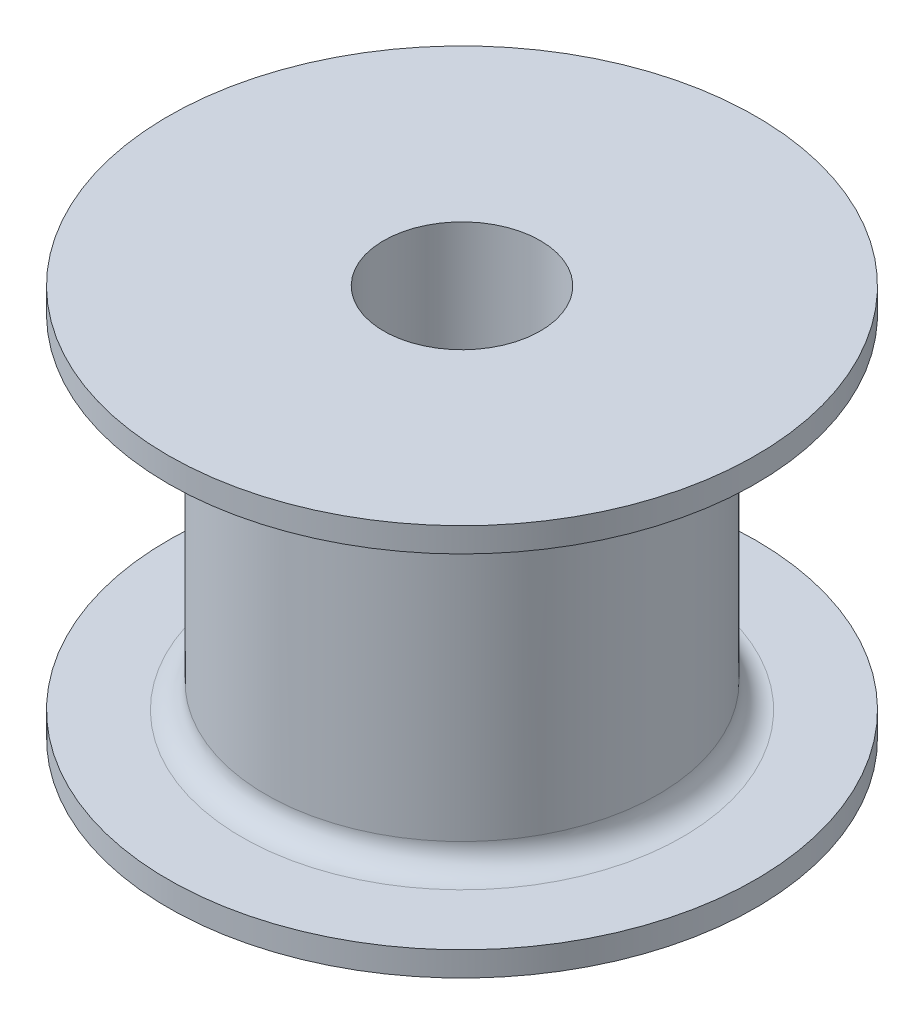
ISO-10303-21;
HEADER;
FILE_DESCRIPTION(('STEP AP214'),'2;1');
FILE_NAME('part.step','',(''),(''),'','','');
FILE_SCHEMA(('AUTOMOTIVE_DESIGN { 1 0 10303 214 1 1 1 1 }'));
ENDSEC;
DATA;
#1=APPLICATION_CONTEXT('core data for automotive mechanical design processes');
#2=APPLICATION_PROTOCOL_DEFINITION('international standard','automotive_design',2000,#1);
#3=PRODUCT_CONTEXT('',#1,'mechanical');
#4=PRODUCT('Part','Part','',(#3));
#5=PRODUCT_RELATED_PRODUCT_CATEGORY('part','',(#4));
#6=PRODUCT_DEFINITION_FORMATION('','',#4);
#7=PRODUCT_DEFINITION_CONTEXT('part definition',#1,'design');
#8=PRODUCT_DEFINITION('design','',#6,#7);
#9=PRODUCT_DEFINITION_SHAPE('','',#8);
#10=(LENGTH_UNIT() NAMED_UNIT(*) SI_UNIT(.MILLI.,.METRE.));
#11=(NAMED_UNIT(*) PLANE_ANGLE_UNIT() SI_UNIT($,.RADIAN.));
#12=(NAMED_UNIT(*) SI_UNIT($,.STERADIAN.) SOLID_ANGLE_UNIT());
#13=UNCERTAINTY_MEASURE_WITH_UNIT(LENGTH_MEASURE(1.E-05),#10,'distance_accuracy_value','');
#14=(GEOMETRIC_REPRESENTATION_CONTEXT(3) GLOBAL_UNCERTAINTY_ASSIGNED_CONTEXT((#13)) GLOBAL_UNIT_ASSIGNED_CONTEXT((#10,
#11,#12)) REPRESENTATION_CONTEXT('',''));
#15=CARTESIAN_POINT('',(0.,0.,0.));
#16=DIRECTION('',(0.,0.,1.));
#17=DIRECTION('',(1.,0.,0.));
#18=AXIS2_PLACEMENT_3D('',#15,#16,#17);
#19=CARTESIAN_POINT('',(0.,7.,0.));
#20=DIRECTION('',(0.,-1.,0.));
#21=DIRECTION('',(0.,0.,-1.));
#22=AXIS2_PLACEMENT_3D('',#19,#20,#21);
#23=CYLINDRICAL_SURFACE('',#22,4.);
#24=CARTESIAN_POINT('',(0.,0.5,0.));
#25=DIRECTION('',(0.,-1.,0.));
#26=DIRECTION('',(0.,0.,-1.));
#27=AXIS2_PLACEMENT_3D('',#24,#25,#26);
#28=CIRCLE('',#27,4.);
#29=CARTESIAN_POINT('',(0.,0.5,-4.));
#30=VERTEX_POINT('',#29);
#31=EDGE_CURVE('E49',#30,#30,#28,.F.);
#32=ORIENTED_EDGE('',*,*,#31,.T.);
#33=EDGE_LOOP('',(#32));
#34=FACE_BOUND('',#33,.T.);
#35=CARTESIAN_POINT('',(0.,6.5,0.));
#36=DIRECTION('',(0.,1.,0.));
#37=DIRECTION('',(0.,0.,1.));
#38=AXIS2_PLACEMENT_3D('',#35,#36,#37);
#39=CIRCLE('',#38,4.);
#40=CARTESIAN_POINT('',(0.,6.5,4.));
#41=VERTEX_POINT('',#40);
#42=EDGE_CURVE('E53',#41,#41,#39,.F.);
#43=ORIENTED_EDGE('',*,*,#42,.T.);
#44=EDGE_LOOP('',(#43));
#45=FACE_BOUND('',#44,.T.);
#46=ADVANCED_FACE('F35',(#34,#45),#23,.T.);
#47=CARTESIAN_POINT('',(0.,7.5,0.));
#48=DIRECTION('',(0.,-1.,0.));
#49=DIRECTION('',(0.,0.,-1.));
#50=AXIS2_PLACEMENT_3D('',#47,#48,#49);
#51=CYLINDRICAL_SURFACE('',#50,6.);
#52=CARTESIAN_POINT('',(0.,7.5,0.));
#53=DIRECTION('',(0.,1.,0.));
#54=DIRECTION('',(0.,0.,1.));
#55=AXIS2_PLACEMENT_3D('',#52,#53,#54);
#56=CIRCLE('',#55,6.);
#57=CARTESIAN_POINT('',(0.,7.5,6.));
#58=VERTEX_POINT('',#57);
#59=EDGE_CURVE('E58',#58,#58,#56,.T.);
#60=ORIENTED_EDGE('',*,*,#59,.F.);
#61=EDGE_LOOP('',(#60));
#62=FACE_BOUND('',#61,.T.);
#63=CARTESIAN_POINT('',(0.,7.,0.));
#64=DIRECTION('',(0.,1.,0.));
#65=DIRECTION('',(0.,0.,1.));
#66=AXIS2_PLACEMENT_3D('',#63,#64,#65);
#67=CIRCLE('',#66,6.);
#68=CARTESIAN_POINT('',(0.,7.,6.));
#69=VERTEX_POINT('',#68);
#70=EDGE_CURVE('E59',#69,#69,#67,.T.);
#71=ORIENTED_EDGE('',*,*,#70,.T.);
#72=EDGE_LOOP('',(#71));
#73=FACE_BOUND('',#72,.T.);
#74=ADVANCED_FACE('F103',(#62,#73),#51,.T.);
#75=CARTESIAN_POINT('',(0.,7.5,0.));
#76=DIRECTION('',(0.,1.,0.));
#77=DIRECTION('',(0.,0.,1.));
#78=AXIS2_PLACEMENT_3D('',#75,#76,#77);
#79=PLANE('',#78);
#80=CARTESIAN_POINT('',(0.,7.5,0.));
#81=DIRECTION('',(0.,-1.,0.));
#82=DIRECTION('',(0.,0.,-1.));
#83=AXIS2_PLACEMENT_3D('',#80,#81,#82);
#84=CIRCLE('',#83,1.6);
#85=CARTESIAN_POINT('',(0.,7.5,-1.6));
#86=VERTEX_POINT('',#85);
#87=EDGE_CURVE('E69',#86,#86,#84,.T.);
#88=ORIENTED_EDGE('',*,*,#87,.T.);
#89=EDGE_LOOP('',(#88));
#90=FACE_BOUND('',#89,.T.);
#91=ORIENTED_EDGE('',*,*,#59,.T.);
#92=EDGE_LOOP('',(#91));
#93=FACE_BOUND('',#92,.T.);
#94=ADVANCED_FACE('F109',(#90,#93),#79,.T.);
#95=CARTESIAN_POINT('',(0.,7.,0.));
#96=DIRECTION('',(0.,1.,0.));
#97=DIRECTION('',(0.,0.,1.));
#98=AXIS2_PLACEMENT_3D('',#95,#96,#97);
#99=PLANE('',#98);
#100=CARTESIAN_POINT('',(0.,7.,0.));
#101=DIRECTION('',(0.,1.,0.));
#102=DIRECTION('',(0.,0.,1.));
#103=AXIS2_PLACEMENT_3D('',#100,#101,#102);
#104=CIRCLE('',#103,4.5);
#105=CARTESIAN_POINT('',(0.,7.,4.5));
#106=VERTEX_POINT('',#105);
#107=EDGE_CURVE('E10',#106,#106,#104,.T.);
#108=ORIENTED_EDGE('',*,*,#107,.T.);
#109=EDGE_LOOP('',(#108));
#110=FACE_BOUND('',#109,.T.);
#111=ORIENTED_EDGE('',*,*,#70,.F.);
#112=EDGE_LOOP('',(#111));
#113=FACE_BOUND('',#112,.T.);
#114=ADVANCED_FACE('F90',(#110,#113),#99,.F.);
#115=CARTESIAN_POINT('',(0.,-0.5,0.));
#116=DIRECTION('',(0.,1.,0.));
#117=DIRECTION('',(0.,0.,1.));
#118=AXIS2_PLACEMENT_3D('',#115,#116,#117);
#119=CYLINDRICAL_SURFACE('',#118,6.);
#120=CARTESIAN_POINT('',(0.,-0.5,0.));
#121=DIRECTION('',(0.,-1.,0.));
#122=DIRECTION('',(0.,0.,-1.));
#123=AXIS2_PLACEMENT_3D('',#120,#121,#122);
#124=CIRCLE('',#123,6.);
#125=CARTESIAN_POINT('',(0.,-0.5,-6.));
#126=VERTEX_POINT('',#125);
#127=EDGE_CURVE('E62',#126,#126,#124,.T.);
#128=ORIENTED_EDGE('',*,*,#127,.F.);
#129=EDGE_LOOP('',(#128));
#130=FACE_BOUND('',#129,.T.);
#131=CARTESIAN_POINT('',(0.,0.,0.));
#132=DIRECTION('',(0.,-1.,0.));
#133=DIRECTION('',(0.,0.,-1.));
#134=AXIS2_PLACEMENT_3D('',#131,#132,#133);
#135=CIRCLE('',#134,6.);
#136=CARTESIAN_POINT('',(0.,0.,-6.));
#137=VERTEX_POINT('',#136);
#138=EDGE_CURVE('E66',#137,#137,#135,.T.);
#139=ORIENTED_EDGE('',*,*,#138,.T.);
#140=EDGE_LOOP('',(#139));
#141=FACE_BOUND('',#140,.T.);
#142=ADVANCED_FACE('F84',(#130,#141),#119,.T.);
#143=CARTESIAN_POINT('',(0.,-0.5,0.));
#144=DIRECTION('',(0.,-1.,0.));
#145=DIRECTION('',(0.,0.,-1.));
#146=AXIS2_PLACEMENT_3D('',#143,#144,#145);
#147=PLANE('',#146);
#148=CARTESIAN_POINT('',(0.,-0.500000000000001,0.));
#149=DIRECTION('',(0.,-1.,0.));
#150=DIRECTION('',(0.,0.,-1.));
#151=AXIS2_PLACEMENT_3D('',#148,#149,#150);
#152=CIRCLE('',#151,1.59999999999999);
#153=CARTESIAN_POINT('',(0.,-0.500000000000001,-1.59999999999999));
#154=VERTEX_POINT('',#153);
#155=EDGE_CURVE('E74',#154,#154,#152,.T.);
#156=ORIENTED_EDGE('',*,*,#155,.F.);
#157=EDGE_LOOP('',(#156));
#158=FACE_BOUND('',#157,.T.);
#159=ORIENTED_EDGE('',*,*,#127,.T.);
#160=EDGE_LOOP('',(#159));
#161=FACE_BOUND('',#160,.T.);
#162=ADVANCED_FACE('F80',(#158,#161),#147,.T.);
#163=CARTESIAN_POINT('',(0.,0.,0.));
#164=DIRECTION('',(0.,-1.,0.));
#165=DIRECTION('',(0.,0.,-1.));
#166=AXIS2_PLACEMENT_3D('',#163,#164,#165);
#167=PLANE('',#166);
#168=CARTESIAN_POINT('',(0.,0.,0.));
#169=DIRECTION('',(0.,-1.,0.));
#170=DIRECTION('',(0.,0.,-1.));
#171=AXIS2_PLACEMENT_3D('',#168,#169,#170);
#172=CIRCLE('',#171,4.5);
#173=CARTESIAN_POINT('',(0.,0.,-4.5));
#174=VERTEX_POINT('',#173);
#175=EDGE_CURVE('E43',#174,#174,#172,.T.);
#176=ORIENTED_EDGE('',*,*,#175,.T.);
#177=EDGE_LOOP('',(#176));
#178=FACE_BOUND('',#177,.T.);
#179=ORIENTED_EDGE('',*,*,#138,.F.);
#180=EDGE_LOOP('',(#179));
#181=FACE_BOUND('',#180,.T.);
#182=ADVANCED_FACE('F83',(#178,#181),#167,.F.);
#183=CARTESIAN_POINT('',(0.,-0.5,0.));
#184=DIRECTION('',(0.,-1.,0.));
#185=DIRECTION('',(0.,0.,-1.));
#186=AXIS2_PLACEMENT_3D('',#183,#184,#185);
#187=CYLINDRICAL_SURFACE('',#186,1.59999999999999);
#188=ORIENTED_EDGE('',*,*,#87,.F.);
#189=EDGE_LOOP('',(#188));
#190=FACE_BOUND('',#189,.T.);
#191=ORIENTED_EDGE('',*,*,#155,.T.);
#192=EDGE_LOOP('',(#191));
#193=FACE_BOUND('',#192,.T.);
#194=ADVANCED_FACE('F78',(#190,#193),#187,.F.);
#195=CARTESIAN_POINT('',(0.,0.5,0.));
#196=DIRECTION('',(0.,-1.,0.));
#197=DIRECTION('',(0.,0.,-1.));
#198=AXIS2_PLACEMENT_3D('',#195,#196,#197);
#199=TOROIDAL_SURFACE('',#198,4.5,0.5);
#200=ORIENTED_EDGE('',*,*,#175,.F.);
#201=EDGE_LOOP('',(#200));
#202=FACE_BOUND('',#201,.T.);
#203=ORIENTED_EDGE('',*,*,#31,.F.);
#204=EDGE_LOOP('',(#203));
#205=FACE_BOUND('',#204,.T.);
#206=ADVANCED_FACE('F99',(#202,#205),#199,.F.);
#207=CARTESIAN_POINT('',(0.,6.5,0.));
#208=DIRECTION('',(0.,1.,0.));
#209=DIRECTION('',(0.,0.,1.));
#210=AXIS2_PLACEMENT_3D('',#207,#208,#209);
#211=TOROIDAL_SURFACE('',#210,4.5,0.5);
#212=ORIENTED_EDGE('',*,*,#42,.F.);
#213=EDGE_LOOP('',(#212));
#214=FACE_BOUND('',#213,.T.);
#215=ORIENTED_EDGE('',*,*,#107,.F.);
#216=EDGE_LOOP('',(#215));
#217=FACE_BOUND('',#216,.T.);
#218=ADVANCED_FACE('F37',(#214,#217),#211,.F.);
#219=CLOSED_SHELL('',(#46,#74,#94,#114,#142,#162,#182,#194,#206,#218));
#220=MANIFOLD_SOLID_BREP('B2',#219);
#221=ADVANCED_BREP_SHAPE_REPRESENTATION('',(#18,#220),#14);
#222=SHAPE_DEFINITION_REPRESENTATION(#9,#221);
ENDSEC;
END-ISO-10303-21;
